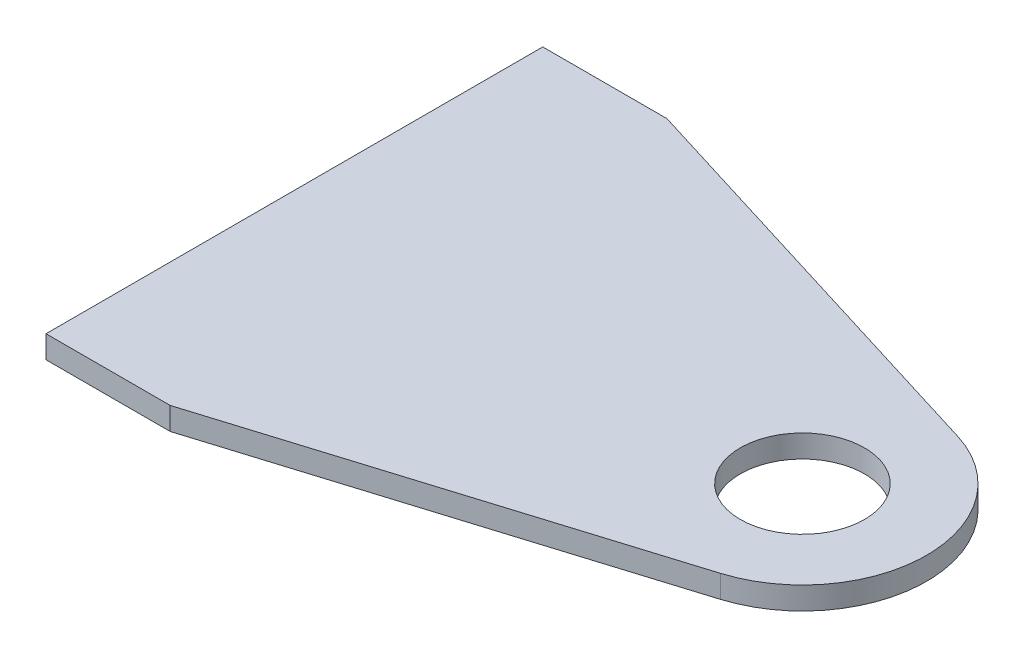
ISO-10303-21;
HEADER;
FILE_DESCRIPTION(('STEP AP214'),'2;1');
FILE_NAME('part.step','',(''),(''),'','','');
FILE_SCHEMA(('AUTOMOTIVE_DESIGN { 1 0 10303 214 1 1 1 1 }'));
ENDSEC;
DATA;
#1=APPLICATION_CONTEXT('core data for automotive mechanical design processes');
#2=APPLICATION_PROTOCOL_DEFINITION('international standard','automotive_design',2000,#1);
#3=PRODUCT_CONTEXT('',#1,'mechanical');
#4=PRODUCT('Part','Part','',(#3));
#5=PRODUCT_RELATED_PRODUCT_CATEGORY('part','',(#4));
#6=PRODUCT_DEFINITION_FORMATION('','',#4);
#7=PRODUCT_DEFINITION_CONTEXT('part definition',#1,'design');
#8=PRODUCT_DEFINITION('design','',#6,#7);
#9=PRODUCT_DEFINITION_SHAPE('','',#8);
#10=(LENGTH_UNIT() NAMED_UNIT(*) SI_UNIT(.MILLI.,.METRE.));
#11=(NAMED_UNIT(*) PLANE_ANGLE_UNIT() SI_UNIT($,.RADIAN.));
#12=(NAMED_UNIT(*) SI_UNIT($,.STERADIAN.) SOLID_ANGLE_UNIT());
#13=UNCERTAINTY_MEASURE_WITH_UNIT(LENGTH_MEASURE(1.E-05),#10,'distance_accuracy_value','');
#14=(GEOMETRIC_REPRESENTATION_CONTEXT(3) GLOBAL_UNCERTAINTY_ASSIGNED_CONTEXT((#13)) GLOBAL_UNIT_ASSIGNED_CONTEXT((#10,
#11,#12)) REPRESENTATION_CONTEXT('',''));
#15=CARTESIAN_POINT('',(0.,0.,0.));
#16=DIRECTION('',(0.,0.,1.));
#17=DIRECTION('',(1.,0.,0.));
#18=AXIS2_PLACEMENT_3D('',#15,#16,#17);
#19=CARTESIAN_POINT('',(0.,10.,0.));
#20=DIRECTION('',(0.,1.,0.));
#21=DIRECTION('',(0.,0.,1.));
#22=AXIS2_PLACEMENT_3D('',#19,#20,#21);
#23=PLANE('',#22);
#24=DIRECTION('',(-0.955565803874091,0.,-0.294777873095084));
#25=VECTOR('',#24,1.);
#26=CARTESIAN_POINT('',(-169.999999999996,10.,-110.000000000014));
#27=LINE('',#26,#25);
#28=CARTESIAN_POINT('',(16.2127830202297,10.,-52.556119213075));
#29=VERTEX_POINT('',#28);
#30=CARTESIAN_POINT('',(-169.999999999996,10.,-110.000000000014));
#31=VERTEX_POINT('',#30);
#32=EDGE_CURVE('E139',#29,#31,#27,.T.);
#33=ORIENTED_EDGE('',*,*,#32,.T.);
#34=DIRECTION('',(-1.,0.,0.));
#35=VECTOR('',#34,1.);
#36=CARTESIAN_POINT('',(-224.999999999996,10.,-110.000000000014));
#37=LINE('',#36,#35);
#38=CARTESIAN_POINT('',(-224.999999999996,10.,-110.000000000014));
#39=VERTEX_POINT('',#38);
#40=EDGE_CURVE('E97',#31,#39,#37,.T.);
#41=ORIENTED_EDGE('',*,*,#40,.T.);
#42=DIRECTION('',(0.,0.,1.));
#43=VECTOR('',#42,1.);
#44=CARTESIAN_POINT('',(-224.999999999996,10.,-110.000000000014));
#45=LINE('',#44,#43);
#46=CARTESIAN_POINT('',(-224.999999999996,10.,109.999999999986));
#47=VERTEX_POINT('',#46);
#48=EDGE_CURVE('E110',#39,#47,#45,.T.);
#49=ORIENTED_EDGE('',*,*,#48,.T.);
#50=DIRECTION('',(1.,0.,0.));
#51=VECTOR('',#50,1.);
#52=CARTESIAN_POINT('',(-224.999999999996,10.,109.999999999986));
#53=LINE('',#52,#51);
#54=CARTESIAN_POINT('',(-169.999999999996,10.,109.999999999986));
#55=VERTEX_POINT('',#54);
#56=EDGE_CURVE('E104',#47,#55,#53,.T.);
#57=ORIENTED_EDGE('',*,*,#56,.T.);
#58=DIRECTION('',(0.955565803874131,0.,-0.294777873094956));
#59=VECTOR('',#58,1.);
#60=CARTESIAN_POINT('',(-169.999999999996,10.,109.999999999986));
#61=LINE('',#60,#59);
#62=CARTESIAN_POINT('',(16.2127830202226,10.,52.5561192130772));
#63=VERTEX_POINT('',#62);
#64=EDGE_CURVE('E108',#55,#63,#61,.T.);
#65=ORIENTED_EDGE('',*,*,#64,.T.);
#66=CARTESIAN_POINT('',(0.,10.,0.));
#67=DIRECTION('',(0.,1.,0.));
#68=DIRECTION('',(0.,0.,1.));
#69=AXIS2_PLACEMENT_3D('',#66,#67,#68);
#70=CIRCLE('',#69,55.);
#71=EDGE_CURVE('E60',#63,#29,#70,.T.);
#72=ORIENTED_EDGE('',*,*,#71,.T.);
#73=EDGE_LOOP('',(#33,#41,#49,#57,#65,#72));
#74=FACE_BOUND('',#73,.T.);
#75=CARTESIAN_POINT('',(0.,10.,0.));
#76=DIRECTION('',(0.,1.,0.));
#77=DIRECTION('',(0.,0.,1.));
#78=AXIS2_PLACEMENT_3D('',#75,#76,#77);
#79=CIRCLE('',#78,27.5);
#80=CARTESIAN_POINT('',(0.,10.,27.5));
#81=VERTEX_POINT('',#80);
#82=EDGE_CURVE('E132',#81,#81,#79,.T.);
#83=ORIENTED_EDGE('',*,*,#82,.F.);
#84=EDGE_LOOP('',(#83));
#85=FACE_BOUND('',#84,.T.);
#86=ADVANCED_FACE('F43',(#74,#85),#23,.T.);
#87=CARTESIAN_POINT('',(0.,0.,0.));
#88=DIRECTION('',(0.,1.,0.));
#89=DIRECTION('',(0.,0.,1.));
#90=AXIS2_PLACEMENT_3D('',#87,#88,#89);
#91=PLANE('',#90);
#92=DIRECTION('',(-0.955565803874091,0.,-0.294777873095084));
#93=VECTOR('',#92,1.);
#94=CARTESIAN_POINT('',(-169.999999999996,0.,-110.000000000014));
#95=LINE('',#94,#93);
#96=CARTESIAN_POINT('',(16.2127830202297,0.,-52.556119213075));
#97=VERTEX_POINT('',#96);
#98=CARTESIAN_POINT('',(-169.999999999996,0.,-110.000000000014));
#99=VERTEX_POINT('',#98);
#100=EDGE_CURVE('E128',#97,#99,#95,.T.);
#101=ORIENTED_EDGE('',*,*,#100,.F.);
#102=CARTESIAN_POINT('',(0.,0.,0.));
#103=DIRECTION('',(0.,1.,0.));
#104=DIRECTION('',(0.,0.,1.));
#105=AXIS2_PLACEMENT_3D('',#102,#103,#104);
#106=CIRCLE('',#105,55.);
#107=CARTESIAN_POINT('',(16.2127830202226,0.,52.5561192130772));
#108=VERTEX_POINT('',#107);
#109=EDGE_CURVE('E89',#108,#97,#106,.T.);
#110=ORIENTED_EDGE('',*,*,#109,.F.);
#111=DIRECTION('',(0.955565803874131,0.,-0.294777873094956));
#112=VECTOR('',#111,1.);
#113=CARTESIAN_POINT('',(-169.999999999996,0.,109.999999999986));
#114=LINE('',#113,#112);
#115=CARTESIAN_POINT('',(-169.999999999996,0.,109.999999999986));
#116=VERTEX_POINT('',#115);
#117=EDGE_CURVE('E83',#116,#108,#114,.T.);
#118=ORIENTED_EDGE('',*,*,#117,.F.);
#119=DIRECTION('',(1.,0.,0.));
#120=VECTOR('',#119,1.);
#121=CARTESIAN_POINT('',(-224.999999999996,0.,109.999999999986));
#122=LINE('',#121,#120);
#123=CARTESIAN_POINT('',(-224.999999999996,0.,109.999999999986));
#124=VERTEX_POINT('',#123);
#125=EDGE_CURVE('E118',#124,#116,#122,.T.);
#126=ORIENTED_EDGE('',*,*,#125,.F.);
#127=DIRECTION('',(0.,0.,1.));
#128=VECTOR('',#127,1.);
#129=CARTESIAN_POINT('',(-224.999999999996,0.,-110.000000000014));
#130=LINE('',#129,#128);
#131=CARTESIAN_POINT('',(-224.999999999996,0.,-110.000000000014));
#132=VERTEX_POINT('',#131);
#133=EDGE_CURVE('E134',#132,#124,#130,.T.);
#134=ORIENTED_EDGE('',*,*,#133,.F.);
#135=DIRECTION('',(-1.,0.,0.));
#136=VECTOR('',#135,1.);
#137=CARTESIAN_POINT('',(-224.999999999996,0.,-110.000000000014));
#138=LINE('',#137,#136);
#139=EDGE_CURVE('E131',#99,#132,#138,.T.);
#140=ORIENTED_EDGE('',*,*,#139,.F.);
#141=EDGE_LOOP('',(#101,#110,#118,#126,#134,#140));
#142=FACE_BOUND('',#141,.T.);
#143=CARTESIAN_POINT('',(0.,0.,0.));
#144=DIRECTION('',(0.,1.,0.));
#145=DIRECTION('',(0.,0.,1.));
#146=AXIS2_PLACEMENT_3D('',#143,#144,#145);
#147=CIRCLE('',#146,27.5);
#148=CARTESIAN_POINT('',(0.,0.,27.5));
#149=VERTEX_POINT('',#148);
#150=EDGE_CURVE('E232',#149,#149,#147,.T.);
#151=ORIENTED_EDGE('',*,*,#150,.T.);
#152=EDGE_LOOP('',(#151));
#153=FACE_BOUND('',#152,.T.);
#154=ADVANCED_FACE('F148',(#142,#153),#91,.F.);
#155=CARTESIAN_POINT('',(-169.999999999996,10.,-110.000000000014));
#156=DIRECTION('',(-0.294777873095084,0.,0.955565803874091));
#157=DIRECTION('',(0.955565803874091,0.,0.294777873095084));
#158=AXIS2_PLACEMENT_3D('',#155,#156,#157);
#159=PLANE('',#158);
#160=ORIENTED_EDGE('',*,*,#100,.T.);
#161=DIRECTION('',(0.,-1.,0.));
#162=VECTOR('',#161,1.);
#163=CARTESIAN_POINT('',(-169.999999999996,10.,-110.000000000014));
#164=LINE('',#163,#162);
#165=EDGE_CURVE('E11',#31,#99,#164,.T.);
#166=ORIENTED_EDGE('',*,*,#165,.F.);
#167=ORIENTED_EDGE('',*,*,#32,.F.);
#168=DIRECTION('',(0.,-1.,0.));
#169=VECTOR('',#168,1.);
#170=CARTESIAN_POINT('',(16.2127830202297,10.,-52.556119213075));
#171=LINE('',#170,#169);
#172=EDGE_CURVE('E124',#29,#97,#171,.T.);
#173=ORIENTED_EDGE('',*,*,#172,.T.);
#174=EDGE_LOOP('',(#160,#166,#167,#173));
#175=FACE_BOUND('',#174,.T.);
#176=ADVANCED_FACE('F45',(#175),#159,.F.);
#177=CARTESIAN_POINT('',(-224.999999999996,10.,-110.000000000014));
#178=DIRECTION('',(0.,0.,1.));
#179=DIRECTION('',(1.,0.,0.));
#180=AXIS2_PLACEMENT_3D('',#177,#178,#179);
#181=PLANE('',#180);
#182=ORIENTED_EDGE('',*,*,#139,.T.);
#183=DIRECTION('',(0.,-1.,0.));
#184=VECTOR('',#183,1.);
#185=CARTESIAN_POINT('',(-224.999999999996,10.,-110.000000000014));
#186=LINE('',#185,#184);
#187=EDGE_CURVE('E52',#39,#132,#186,.T.);
#188=ORIENTED_EDGE('',*,*,#187,.F.);
#189=ORIENTED_EDGE('',*,*,#40,.F.);
#190=ORIENTED_EDGE('',*,*,#165,.T.);
#191=EDGE_LOOP('',(#182,#188,#189,#190));
#192=FACE_BOUND('',#191,.T.);
#193=ADVANCED_FACE('F173',(#192),#181,.F.);
#194=CARTESIAN_POINT('',(-224.999999999996,10.,-110.000000000014));
#195=DIRECTION('',(1.,0.,0.));
#196=DIRECTION('',(0.,0.,-1.));
#197=AXIS2_PLACEMENT_3D('',#194,#195,#196);
#198=PLANE('',#197);
#199=ORIENTED_EDGE('',*,*,#133,.T.);
#200=DIRECTION('',(0.,-1.,0.));
#201=VECTOR('',#200,1.);
#202=CARTESIAN_POINT('',(-224.999999999996,10.,109.999999999986));
#203=LINE('',#202,#201);
#204=EDGE_CURVE('E119',#47,#124,#203,.T.);
#205=ORIENTED_EDGE('',*,*,#204,.F.);
#206=ORIENTED_EDGE('',*,*,#48,.F.);
#207=ORIENTED_EDGE('',*,*,#187,.T.);
#208=EDGE_LOOP('',(#199,#205,#206,#207));
#209=FACE_BOUND('',#208,.T.);
#210=ADVANCED_FACE('F145',(#209),#198,.F.);
#211=CARTESIAN_POINT('',(-224.999999999996,10.,109.999999999986));
#212=DIRECTION('',(0.,0.,-1.));
#213=DIRECTION('',(-1.,0.,0.));
#214=AXIS2_PLACEMENT_3D('',#211,#212,#213);
#215=PLANE('',#214);
#216=ORIENTED_EDGE('',*,*,#125,.T.);
#217=DIRECTION('',(0.,-1.,0.));
#218=VECTOR('',#217,1.);
#219=CARTESIAN_POINT('',(-169.999999999996,10.,109.999999999986));
#220=LINE('',#219,#218);
#221=EDGE_CURVE('E115',#55,#116,#220,.T.);
#222=ORIENTED_EDGE('',*,*,#221,.F.);
#223=ORIENTED_EDGE('',*,*,#56,.F.);
#224=ORIENTED_EDGE('',*,*,#204,.T.);
#225=EDGE_LOOP('',(#216,#222,#223,#224));
#226=FACE_BOUND('',#225,.T.);
#227=ADVANCED_FACE('F116',(#226),#215,.F.);
#228=CARTESIAN_POINT('',(-169.999999999996,10.,109.999999999986));
#229=DIRECTION('',(-0.294777873094956,0.,-0.955565803874131));
#230=DIRECTION('',(-0.955565803874131,0.,0.294777873094956));
#231=AXIS2_PLACEMENT_3D('',#228,#229,#230);
#232=PLANE('',#231);
#233=ORIENTED_EDGE('',*,*,#117,.T.);
#234=DIRECTION('',(0.,-1.,0.));
#235=VECTOR('',#234,1.);
#236=CARTESIAN_POINT('',(16.2127830202226,10.,52.5561192130772));
#237=LINE('',#236,#235);
#238=EDGE_CURVE('E120',#63,#108,#237,.T.);
#239=ORIENTED_EDGE('',*,*,#238,.F.);
#240=ORIENTED_EDGE('',*,*,#64,.F.);
#241=ORIENTED_EDGE('',*,*,#221,.T.);
#242=EDGE_LOOP('',(#233,#239,#240,#241));
#243=FACE_BOUND('',#242,.T.);
#244=ADVANCED_FACE('F122',(#243),#232,.F.);
#245=CARTESIAN_POINT('',(0.,10.,0.));
#246=DIRECTION('',(0.,-1.,0.));
#247=DIRECTION('',(0.,0.,-1.));
#248=AXIS2_PLACEMENT_3D('',#245,#246,#247);
#249=CYLINDRICAL_SURFACE('',#248,55.);
#250=ORIENTED_EDGE('',*,*,#109,.T.);
#251=ORIENTED_EDGE('',*,*,#172,.F.);
#252=ORIENTED_EDGE('',*,*,#71,.F.);
#253=ORIENTED_EDGE('',*,*,#238,.T.);
#254=EDGE_LOOP('',(#250,#251,#252,#253));
#255=FACE_BOUND('',#254,.T.);
#256=ADVANCED_FACE('F153',(#255),#249,.T.);
#257=CARTESIAN_POINT('',(0.,10.,0.));
#258=DIRECTION('',(0.,-1.,0.));
#259=DIRECTION('',(0.,0.,-1.));
#260=AXIS2_PLACEMENT_3D('',#257,#258,#259);
#261=CYLINDRICAL_SURFACE('',#260,27.5);
#262=ORIENTED_EDGE('',*,*,#82,.T.);
#263=EDGE_LOOP('',(#262));
#264=FACE_BOUND('',#263,.T.);
#265=ORIENTED_EDGE('',*,*,#150,.F.);
#266=EDGE_LOOP('',(#265));
#267=FACE_BOUND('',#266,.T.);
#268=ADVANCED_FACE('F155',(#264,#267),#261,.F.);
#269=CLOSED_SHELL('',(#86,#154,#176,#193,#210,#227,#244,#256,#268));
#270=MANIFOLD_SOLID_BREP('B2',#269);
#271=ADVANCED_BREP_SHAPE_REPRESENTATION('',(#18,#270),#14);
#272=SHAPE_DEFINITION_REPRESENTATION(#9,#271);
ENDSEC;
END-ISO-10303-21;
